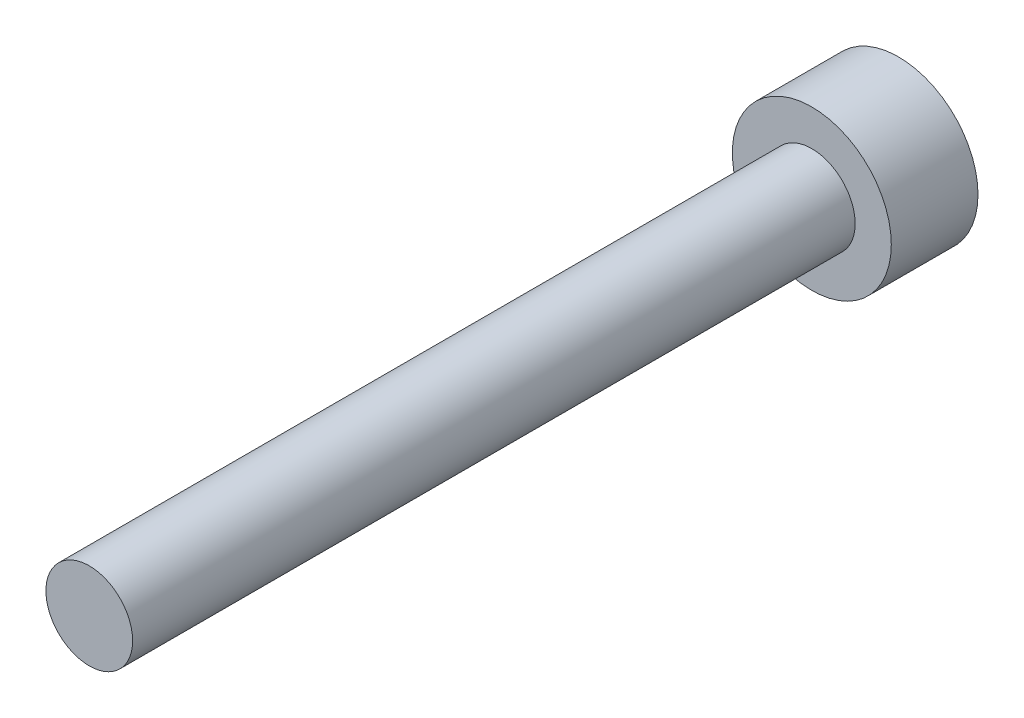
ISO-10303-21;
HEADER;
FILE_DESCRIPTION(('STEP AP214'),'2;1');
FILE_NAME('part.step','',(''),(''),'','','');
FILE_SCHEMA(('AUTOMOTIVE_DESIGN { 1 0 10303 214 1 1 1 1 }'));
ENDSEC;
DATA;
#1=APPLICATION_CONTEXT('core data for automotive mechanical design processes');
#2=APPLICATION_PROTOCOL_DEFINITION('international standard','automotive_design',2000,#1);
#3=PRODUCT_CONTEXT('',#1,'mechanical');
#4=PRODUCT('Part','Part','',(#3));
#5=PRODUCT_RELATED_PRODUCT_CATEGORY('part','',(#4));
#6=PRODUCT_DEFINITION_FORMATION('','',#4);
#7=PRODUCT_DEFINITION_CONTEXT('part definition',#1,'design');
#8=PRODUCT_DEFINITION('design','',#6,#7);
#9=PRODUCT_DEFINITION_SHAPE('','',#8);
#10=(LENGTH_UNIT() NAMED_UNIT(*) SI_UNIT(.MILLI.,.METRE.));
#11=(NAMED_UNIT(*) PLANE_ANGLE_UNIT() SI_UNIT($,.RADIAN.));
#12=(NAMED_UNIT(*) SI_UNIT($,.STERADIAN.) SOLID_ANGLE_UNIT());
#13=UNCERTAINTY_MEASURE_WITH_UNIT(LENGTH_MEASURE(1.E-05),#10,'distance_accuracy_value','');
#14=(GEOMETRIC_REPRESENTATION_CONTEXT(3) GLOBAL_UNCERTAINTY_ASSIGNED_CONTEXT((#13)) GLOBAL_UNIT_ASSIGNED_CONTEXT((#10,
#11,#12)) REPRESENTATION_CONTEXT('',''));
#15=CARTESIAN_POINT('',(0.,0.,0.));
#16=DIRECTION('',(0.,0.,1.));
#17=DIRECTION('',(1.,0.,0.));
#18=AXIS2_PLACEMENT_3D('',#15,#16,#17);
#19=CARTESIAN_POINT('',(0.,0.,-3.));
#20=DIRECTION('',(0.,0.,1.));
#21=DIRECTION('',(1.,0.,0.));
#22=AXIS2_PLACEMENT_3D('',#19,#20,#21);
#23=PLANE('',#22);
#24=CARTESIAN_POINT('',(0.,0.,-3.));
#25=DIRECTION('',(0.,0.,1.));
#26=DIRECTION('',(1.,0.,0.));
#27=AXIS2_PLACEMENT_3D('',#24,#25,#26);
#28=CIRCLE('',#27,2.75);
#29=CARTESIAN_POINT('',(2.75,0.,-3.));
#30=VERTEX_POINT('',#29);
#31=EDGE_CURVE('E50',#30,#30,#28,.T.);
#32=ORIENTED_EDGE('',*,*,#31,.F.);
#33=EDGE_LOOP('',(#32));
#34=FACE_BOUND('',#33,.T.);
#35=DIRECTION('',(0.866025403784441,-0.499999999999995,0.));
#36=VECTOR('',#35,1.);
#37=CARTESIAN_POINT('',(-1.24999999999999,-0.721687836487047,-3.));
#38=LINE('',#37,#36);
#39=CARTESIAN_POINT('',(-1.24999999999999,-0.721687836487047,-3.));
#40=VERTEX_POINT('',#39);
#41=CARTESIAN_POINT('',(0.,-1.44337567297406,-3.));
#42=VERTEX_POINT('',#41);
#43=EDGE_CURVE('E62',#40,#42,#38,.T.);
#44=ORIENTED_EDGE('',*,*,#43,.T.);
#45=DIRECTION('',(0.866025403784438,0.500000000000001,0.));
#46=VECTOR('',#45,1.);
#47=CARTESIAN_POINT('',(0.,-1.44337567297406,-3.));
#48=LINE('',#47,#46);
#49=CARTESIAN_POINT('',(1.25,-0.721687836487029,-3.));
#50=VERTEX_POINT('',#49);
#51=EDGE_CURVE('E139',#42,#50,#48,.T.);
#52=ORIENTED_EDGE('',*,*,#51,.T.);
#53=DIRECTION('',(0.,1.,0.));
#54=VECTOR('',#53,1.);
#55=CARTESIAN_POINT('',(1.25,-0.721687836487029,-3.));
#56=LINE('',#55,#54);
#57=CARTESIAN_POINT('',(1.25,0.721687836487038,-3.));
#58=VERTEX_POINT('',#57);
#59=EDGE_CURVE('E142',#50,#58,#56,.T.);
#60=ORIENTED_EDGE('',*,*,#59,.T.);
#61=DIRECTION('',(-0.866025403784442,0.499999999999995,0.));
#62=VECTOR('',#61,1.);
#63=CARTESIAN_POINT('',(1.25,0.721687836487038,-3.));
#64=LINE('',#63,#62);
#65=CARTESIAN_POINT('',(0.,1.44337567297406,-3.));
#66=VERTEX_POINT('',#65);
#67=EDGE_CURVE('E148',#58,#66,#64,.T.);
#68=ORIENTED_EDGE('',*,*,#67,.T.);
#69=DIRECTION('',(-0.866025403784434,-0.500000000000007,0.));
#70=VECTOR('',#69,1.);
#71=CARTESIAN_POINT('',(0.,1.44337567297406,-3.));
#72=LINE('',#71,#70);
#73=CARTESIAN_POINT('',(-1.25000000000001,0.721687836487021,-3.));
#74=VERTEX_POINT('',#73);
#75=EDGE_CURVE('E123',#66,#74,#72,.T.);
#76=ORIENTED_EDGE('',*,*,#75,.T.);
#77=DIRECTION('',(0.,-1.,0.));
#78=VECTOR('',#77,1.);
#79=CARTESIAN_POINT('',(-1.25000000000001,0.721687836487021,-3.));
#80=LINE('',#79,#78);
#81=EDGE_CURVE('E151',#74,#40,#80,.T.);
#82=ORIENTED_EDGE('',*,*,#81,.T.);
#83=EDGE_LOOP('',(#44,#52,#60,#68,#76,#82));
#84=FACE_BOUND('',#83,.T.);
#85=ADVANCED_FACE('F43',(#34,#84),#23,.F.);
#86=CARTESIAN_POINT('',(0.,0.,0.));
#87=DIRECTION('',(0.,0.,-1.));
#88=DIRECTION('',(-1.,0.,0.));
#89=AXIS2_PLACEMENT_3D('',#86,#87,#88);
#90=CYLINDRICAL_SURFACE('',#89,2.75);
#91=CARTESIAN_POINT('',(0.,0.,0.));
#92=DIRECTION('',(0.,0.,1.));
#93=DIRECTION('',(1.,0.,0.));
#94=AXIS2_PLACEMENT_3D('',#91,#92,#93);
#95=CIRCLE('',#94,2.75);
#96=CARTESIAN_POINT('',(2.75,0.,0.));
#97=VERTEX_POINT('',#96);
#98=EDGE_CURVE('E52',#97,#97,#95,.T.);
#99=ORIENTED_EDGE('',*,*,#98,.F.);
#100=EDGE_LOOP('',(#99));
#101=FACE_BOUND('',#100,.T.);
#102=ORIENTED_EDGE('',*,*,#31,.T.);
#103=EDGE_LOOP('',(#102));
#104=FACE_BOUND('',#103,.T.);
#105=ADVANCED_FACE('F44',(#101,#104),#90,.T.);
#106=CARTESIAN_POINT('',(0.,0.,0.));
#107=DIRECTION('',(0.,0.,1.));
#108=DIRECTION('',(1.,0.,0.));
#109=AXIS2_PLACEMENT_3D('',#106,#107,#108);
#110=PLANE('',#109);
#111=CARTESIAN_POINT('',(0.,0.,0.));
#112=DIRECTION('',(0.,0.,1.));
#113=DIRECTION('',(1.,0.,0.));
#114=AXIS2_PLACEMENT_3D('',#111,#112,#113);
#115=CIRCLE('',#114,1.5);
#116=CARTESIAN_POINT('',(1.5,0.,0.));
#117=VERTEX_POINT('',#116);
#118=EDGE_CURVE('E11',#117,#117,#115,.T.);
#119=ORIENTED_EDGE('',*,*,#118,.F.);
#120=EDGE_LOOP('',(#119));
#121=FACE_BOUND('',#120,.T.);
#122=ORIENTED_EDGE('',*,*,#98,.T.);
#123=EDGE_LOOP('',(#122));
#124=FACE_BOUND('',#123,.T.);
#125=ADVANCED_FACE('F211',(#121,#124),#110,.T.);
#126=CARTESIAN_POINT('',(0.,0.,25.));
#127=DIRECTION('',(0.,0.,-1.));
#128=DIRECTION('',(-1.,0.,0.));
#129=AXIS2_PLACEMENT_3D('',#126,#127,#128);
#130=CYLINDRICAL_SURFACE('',#129,1.5);
#131=CARTESIAN_POINT('',(0.,0.,25.));
#132=DIRECTION('',(0.,0.,1.));
#133=DIRECTION('',(1.,0.,0.));
#134=AXIS2_PLACEMENT_3D('',#131,#132,#133);
#135=CIRCLE('',#134,1.5);
#136=CARTESIAN_POINT('',(1.5,0.,25.));
#137=VERTEX_POINT('',#136);
#138=EDGE_CURVE('E170',#137,#137,#135,.T.);
#139=ORIENTED_EDGE('',*,*,#138,.F.);
#140=EDGE_LOOP('',(#139));
#141=FACE_BOUND('',#140,.T.);
#142=ORIENTED_EDGE('',*,*,#118,.T.);
#143=EDGE_LOOP('',(#142));
#144=FACE_BOUND('',#143,.T.);
#145=ADVANCED_FACE('F210',(#141,#144),#130,.T.);
#146=CARTESIAN_POINT('',(0.,0.,25.));
#147=DIRECTION('',(0.,0.,1.));
#148=DIRECTION('',(1.,0.,0.));
#149=AXIS2_PLACEMENT_3D('',#146,#147,#148);
#150=PLANE('',#149);
#151=ORIENTED_EDGE('',*,*,#138,.T.);
#152=EDGE_LOOP('',(#151));
#153=FACE_BOUND('',#152,.T.);
#154=ADVANCED_FACE('F203',(#153),#150,.T.);
#155=CARTESIAN_POINT('',(-1.24999999999999,-0.721687836487047,-1.5));
#156=DIRECTION('',(0.499999999999995,0.866025403784441,0.));
#157=DIRECTION('',(-0.866025403784442,0.499999999999995,0.));
#158=AXIS2_PLACEMENT_3D('',#155,#156,#157);
#159=PLANE('',#158);
#160=ORIENTED_EDGE('',*,*,#43,.F.);
#161=DIRECTION('',(0.,0.,-1.));
#162=VECTOR('',#161,1.);
#163=CARTESIAN_POINT('',(-1.24999999999999,-0.721687836487047,-1.5));
#164=LINE('',#163,#162);
#165=CARTESIAN_POINT('',(-1.24999999999999,-0.721687836487047,-1.5));
#166=VERTEX_POINT('',#165);
#167=EDGE_CURVE('E134',#166,#40,#164,.T.);
#168=ORIENTED_EDGE('',*,*,#167,.F.);
#169=DIRECTION('',(0.866025403784441,-0.499999999999995,0.));
#170=VECTOR('',#169,1.);
#171=CARTESIAN_POINT('',(-1.24999999999999,-0.721687836487047,-1.5));
#172=LINE('',#171,#170);
#173=CARTESIAN_POINT('',(0.,-1.44337567297406,-1.5));
#174=VERTEX_POINT('',#173);
#175=EDGE_CURVE('E154',#166,#174,#172,.T.);
#176=ORIENTED_EDGE('',*,*,#175,.T.);
#177=DIRECTION('',(0.,0.,-1.));
#178=VECTOR('',#177,1.);
#179=CARTESIAN_POINT('',(0.,-1.44337567297406,-1.5));
#180=LINE('',#179,#178);
#181=EDGE_CURVE('E163',#174,#42,#180,.T.);
#182=ORIENTED_EDGE('',*,*,#181,.T.);
#183=EDGE_LOOP('',(#160,#168,#176,#182));
#184=FACE_BOUND('',#183,.T.);
#185=ADVANCED_FACE('F185',(#184),#159,.T.);
#186=CARTESIAN_POINT('',(0.,-1.44337567297406,-1.5));
#187=DIRECTION('',(-0.500000000000001,0.866025403784438,0.));
#188=DIRECTION('',(-0.866025403784438,-0.500000000000001,0.));
#189=AXIS2_PLACEMENT_3D('',#186,#187,#188);
#190=PLANE('',#189);
#191=ORIENTED_EDGE('',*,*,#51,.F.);
#192=ORIENTED_EDGE('',*,*,#181,.F.);
#193=DIRECTION('',(0.866025403784438,0.500000000000001,0.));
#194=VECTOR('',#193,1.);
#195=CARTESIAN_POINT('',(0.,-1.44337567297406,-1.5));
#196=LINE('',#195,#194);
#197=CARTESIAN_POINT('',(1.25,-0.721687836487029,-1.5));
#198=VERTEX_POINT('',#197);
#199=EDGE_CURVE('E99',#174,#198,#196,.T.);
#200=ORIENTED_EDGE('',*,*,#199,.T.);
#201=DIRECTION('',(0.,0.,-1.));
#202=VECTOR('',#201,1.);
#203=CARTESIAN_POINT('',(1.25,-0.721687836487029,-1.5));
#204=LINE('',#203,#202);
#205=EDGE_CURVE('E161',#198,#50,#204,.T.);
#206=ORIENTED_EDGE('',*,*,#205,.T.);
#207=EDGE_LOOP('',(#191,#192,#200,#206));
#208=FACE_BOUND('',#207,.T.);
#209=ADVANCED_FACE('F194',(#208),#190,.T.);
#210=CARTESIAN_POINT('',(1.25,-0.721687836487029,-1.5));
#211=DIRECTION('',(-1.,0.,0.));
#212=DIRECTION('',(0.,-1.,0.));
#213=AXIS2_PLACEMENT_3D('',#210,#211,#212);
#214=PLANE('',#213);
#215=ORIENTED_EDGE('',*,*,#59,.F.);
#216=ORIENTED_EDGE('',*,*,#205,.F.);
#217=DIRECTION('',(0.,1.,0.));
#218=VECTOR('',#217,1.);
#219=CARTESIAN_POINT('',(1.25,-0.721687836487029,-1.5));
#220=LINE('',#219,#218);
#221=CARTESIAN_POINT('',(1.25,0.721687836487038,-1.5));
#222=VERTEX_POINT('',#221);
#223=EDGE_CURVE('E116',#198,#222,#220,.T.);
#224=ORIENTED_EDGE('',*,*,#223,.T.);
#225=DIRECTION('',(0.,0.,-1.));
#226=VECTOR('',#225,1.);
#227=CARTESIAN_POINT('',(1.25,0.721687836487038,-1.5));
#228=LINE('',#227,#226);
#229=EDGE_CURVE('E113',#222,#58,#228,.T.);
#230=ORIENTED_EDGE('',*,*,#229,.T.);
#231=EDGE_LOOP('',(#215,#216,#224,#230));
#232=FACE_BOUND('',#231,.T.);
#233=ADVANCED_FACE('F195',(#232),#214,.T.);
#234=CARTESIAN_POINT('',(1.25,0.721687836487038,-1.5));
#235=DIRECTION('',(-0.499999999999995,-0.866025403784441,0.));
#236=DIRECTION('',(0.866025403784442,-0.499999999999995,0.));
#237=AXIS2_PLACEMENT_3D('',#234,#235,#236);
#238=PLANE('',#237);
#239=ORIENTED_EDGE('',*,*,#67,.F.);
#240=ORIENTED_EDGE('',*,*,#229,.F.);
#241=DIRECTION('',(-0.866025403784442,0.499999999999995,0.));
#242=VECTOR('',#241,1.);
#243=CARTESIAN_POINT('',(1.25,0.721687836487038,-1.5));
#244=LINE('',#243,#242);
#245=CARTESIAN_POINT('',(0.,1.44337567297406,-1.5));
#246=VERTEX_POINT('',#245);
#247=EDGE_CURVE('E109',#222,#246,#244,.T.);
#248=ORIENTED_EDGE('',*,*,#247,.T.);
#249=DIRECTION('',(0.,0.,-1.));
#250=VECTOR('',#249,1.);
#251=CARTESIAN_POINT('',(0.,1.44337567297406,-1.5));
#252=LINE('',#251,#250);
#253=EDGE_CURVE('E111',#246,#66,#252,.T.);
#254=ORIENTED_EDGE('',*,*,#253,.T.);
#255=EDGE_LOOP('',(#239,#240,#248,#254));
#256=FACE_BOUND('',#255,.T.);
#257=ADVANCED_FACE('F114',(#256),#238,.T.);
#258=CARTESIAN_POINT('',(0.,1.44337567297406,-1.5));
#259=DIRECTION('',(0.500000000000007,-0.866025403784435,0.));
#260=DIRECTION('',(0.866025403784434,0.500000000000007,0.));
#261=AXIS2_PLACEMENT_3D('',#258,#259,#260);
#262=PLANE('',#261);
#263=ORIENTED_EDGE('',*,*,#75,.F.);
#264=ORIENTED_EDGE('',*,*,#253,.F.);
#265=DIRECTION('',(-0.866025403784434,-0.500000000000007,0.));
#266=VECTOR('',#265,1.);
#267=CARTESIAN_POINT('',(0.,1.44337567297406,-1.5));
#268=LINE('',#267,#266);
#269=CARTESIAN_POINT('',(-1.25000000000001,0.721687836487021,-1.5));
#270=VERTEX_POINT('',#269);
#271=EDGE_CURVE('E119',#246,#270,#268,.T.);
#272=ORIENTED_EDGE('',*,*,#271,.T.);
#273=DIRECTION('',(0.,0.,-1.));
#274=VECTOR('',#273,1.);
#275=CARTESIAN_POINT('',(-1.25000000000001,0.721687836487021,-1.5));
#276=LINE('',#275,#274);
#277=EDGE_CURVE('E93',#270,#74,#276,.T.);
#278=ORIENTED_EDGE('',*,*,#277,.T.);
#279=EDGE_LOOP('',(#263,#264,#272,#278));
#280=FACE_BOUND('',#279,.T.);
#281=ADVANCED_FACE('F122',(#280),#262,.T.);
#282=CARTESIAN_POINT('',(-1.25000000000001,0.721687836487021,-1.5));
#283=DIRECTION('',(1.,0.,0.));
#284=DIRECTION('',(0.,1.,0.));
#285=AXIS2_PLACEMENT_3D('',#282,#283,#284);
#286=PLANE('',#285);
#287=ORIENTED_EDGE('',*,*,#81,.F.);
#288=ORIENTED_EDGE('',*,*,#277,.F.);
#289=DIRECTION('',(0.,-1.,0.));
#290=VECTOR('',#289,1.);
#291=CARTESIAN_POINT('',(-1.25000000000001,0.721687836487021,-1.5));
#292=LINE('',#291,#290);
#293=EDGE_CURVE('E69',#270,#166,#292,.T.);
#294=ORIENTED_EDGE('',*,*,#293,.T.);
#295=ORIENTED_EDGE('',*,*,#167,.T.);
#296=EDGE_LOOP('',(#287,#288,#294,#295));
#297=FACE_BOUND('',#296,.T.);
#298=ADVANCED_FACE('F182',(#297),#286,.T.);
#299=CARTESIAN_POINT('',(0.,0.,-1.5));
#300=DIRECTION('',(0.,0.,1.));
#301=DIRECTION('',(1.,0.,0.));
#302=AXIS2_PLACEMENT_3D('',#299,#300,#301);
#303=PLANE('',#302);
#304=ORIENTED_EDGE('',*,*,#175,.F.);
#305=ORIENTED_EDGE('',*,*,#293,.F.);
#306=ORIENTED_EDGE('',*,*,#271,.F.);
#307=ORIENTED_EDGE('',*,*,#247,.F.);
#308=ORIENTED_EDGE('',*,*,#223,.F.);
#309=ORIENTED_EDGE('',*,*,#199,.F.);
#310=EDGE_LOOP('',(#304,#305,#306,#307,#308,#309));
#311=FACE_BOUND('',#310,.T.);
#312=ADVANCED_FACE('F130',(#311),#303,.F.);
#313=CLOSED_SHELL('',(#85,#105,#125,#145,#154,#185,#209,#233,#257,#281,#298,#312));
#314=MANIFOLD_SOLID_BREP('B2',#313);
#315=ADVANCED_BREP_SHAPE_REPRESENTATION('',(#18,#314),#14);
#316=SHAPE_DEFINITION_REPRESENTATION(#9,#315);
ENDSEC;
END-ISO-10303-21;
